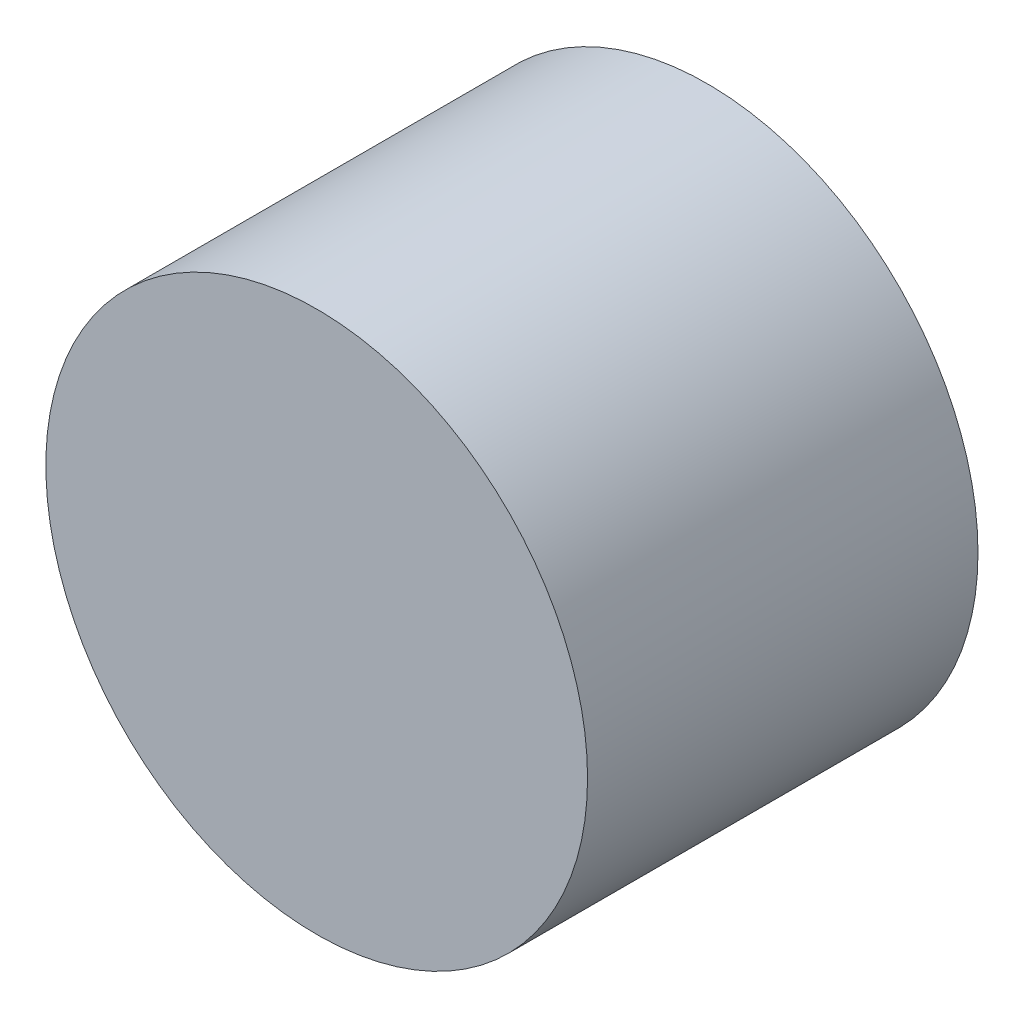
ISO-10303-21;
HEADER;
FILE_DESCRIPTION(('STEP AP214'),'2;1');
FILE_NAME('part.step','',(''),(''),'','','');
FILE_SCHEMA(('AUTOMOTIVE_DESIGN { 1 0 10303 214 1 1 1 1 }'));
ENDSEC;
DATA;
#1=APPLICATION_CONTEXT('core data for automotive mechanical design processes');
#2=APPLICATION_PROTOCOL_DEFINITION('international standard','automotive_design',2000,#1);
#3=PRODUCT_CONTEXT('',#1,'mechanical');
#4=PRODUCT('Part','Part','',(#3));
#5=PRODUCT_RELATED_PRODUCT_CATEGORY('part','',(#4));
#6=PRODUCT_DEFINITION_FORMATION('','',#4);
#7=PRODUCT_DEFINITION_CONTEXT('part definition',#1,'design');
#8=PRODUCT_DEFINITION('design','',#6,#7);
#9=PRODUCT_DEFINITION_SHAPE('','',#8);
#10=(LENGTH_UNIT() NAMED_UNIT(*) SI_UNIT(.MILLI.,.METRE.));
#11=(NAMED_UNIT(*) PLANE_ANGLE_UNIT() SI_UNIT($,.RADIAN.));
#12=(NAMED_UNIT(*) SI_UNIT($,.STERADIAN.) SOLID_ANGLE_UNIT());
#13=UNCERTAINTY_MEASURE_WITH_UNIT(LENGTH_MEASURE(1.E-05),#10,'distance_accuracy_value','');
#14=(GEOMETRIC_REPRESENTATION_CONTEXT(3) GLOBAL_UNCERTAINTY_ASSIGNED_CONTEXT((#13)) GLOBAL_UNIT_ASSIGNED_CONTEXT((#10,
#11,#12)) REPRESENTATION_CONTEXT('',''));
#15=CARTESIAN_POINT('',(0.,0.,0.));
#16=DIRECTION('',(0.,0.,1.));
#17=DIRECTION('',(1.,0.,0.));
#18=AXIS2_PLACEMENT_3D('',#15,#16,#17);
#19=CARTESIAN_POINT('',(0.,0.,2.));
#20=DIRECTION('',(0.,0.,-1.));
#21=DIRECTION('',(-1.,0.,0.));
#22=AXIS2_PLACEMENT_3D('',#19,#20,#21);
#23=CYLINDRICAL_SURFACE('',#22,1.3875);
#24=CARTESIAN_POINT('',(0.,0.,2.));
#25=DIRECTION('',(0.,0.,1.));
#26=DIRECTION('',(1.,0.,0.));
#27=AXIS2_PLACEMENT_3D('',#24,#25,#26);
#28=CIRCLE('',#27,1.3875);
#29=CARTESIAN_POINT('',(1.3875,0.,2.));
#30=VERTEX_POINT('',#29);
#31=EDGE_CURVE('E10',#30,#30,#28,.T.);
#32=ORIENTED_EDGE('',*,*,#31,.F.);
#33=EDGE_LOOP('',(#32));
#34=FACE_BOUND('',#33,.T.);
#35=CARTESIAN_POINT('',(0.,0.,0.));
#36=DIRECTION('',(0.,0.,1.));
#37=DIRECTION('',(1.,0.,0.));
#38=AXIS2_PLACEMENT_3D('',#35,#36,#37);
#39=CIRCLE('',#38,1.3875);
#40=CARTESIAN_POINT('',(1.3875,0.,0.));
#41=VERTEX_POINT('',#40);
#42=EDGE_CURVE('E40',#41,#41,#39,.T.);
#43=ORIENTED_EDGE('',*,*,#42,.T.);
#44=EDGE_LOOP('',(#43));
#45=FACE_BOUND('',#44,.T.);
#46=ADVANCED_FACE('F37',(#34,#45),#23,.T.);
#47=CARTESIAN_POINT('',(0.,0.,2.));
#48=DIRECTION('',(0.,0.,1.));
#49=DIRECTION('',(1.,0.,0.));
#50=AXIS2_PLACEMENT_3D('',#47,#48,#49);
#51=PLANE('',#50);
#52=ORIENTED_EDGE('',*,*,#31,.T.);
#53=EDGE_LOOP('',(#52));
#54=FACE_BOUND('',#53,.T.);
#55=ADVANCED_FACE('F52',(#54),#51,.T.);
#56=CARTESIAN_POINT('',(0.,0.,0.));
#57=DIRECTION('',(0.,0.,1.));
#58=DIRECTION('',(1.,0.,0.));
#59=AXIS2_PLACEMENT_3D('',#56,#57,#58);
#60=PLANE('',#59);
#61=ORIENTED_EDGE('',*,*,#42,.F.);
#62=EDGE_LOOP('',(#61));
#63=FACE_BOUND('',#62,.T.);
#64=ADVANCED_FACE('F50',(#63),#60,.F.);
#65=CLOSED_SHELL('',(#46,#55,#64));
#66=MANIFOLD_SOLID_BREP('B2',#65);
#67=ADVANCED_BREP_SHAPE_REPRESENTATION('',(#18,#66),#14);
#68=SHAPE_DEFINITION_REPRESENTATION(#9,#67);
ENDSEC;
END-ISO-10303-21;
